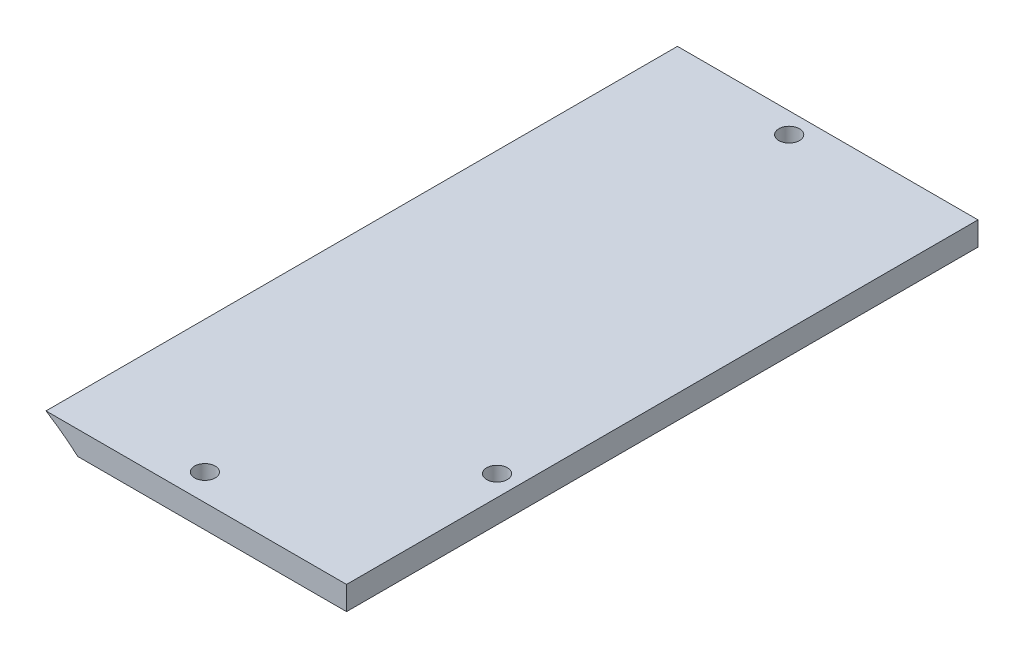
ISO-10303-21;
HEADER;
FILE_DESCRIPTION(('STEP AP214'),'2;1');
FILE_NAME('part.step','',(''),(''),'','','');
FILE_SCHEMA(('AUTOMOTIVE_DESIGN { 1 0 10303 214 1 1 1 1 }'));
ENDSEC;
DATA;
#1=APPLICATION_CONTEXT('core data for automotive mechanical design processes');
#2=APPLICATION_PROTOCOL_DEFINITION('international standard','automotive_design',2000,#1);
#3=PRODUCT_CONTEXT('',#1,'mechanical');
#4=PRODUCT('Part','Part','',(#3));
#5=PRODUCT_RELATED_PRODUCT_CATEGORY('part','',(#4));
#6=PRODUCT_DEFINITION_FORMATION('','',#4);
#7=PRODUCT_DEFINITION_CONTEXT('part definition',#1,'design');
#8=PRODUCT_DEFINITION('design','',#6,#7);
#9=PRODUCT_DEFINITION_SHAPE('','',#8);
#10=(LENGTH_UNIT() NAMED_UNIT(*) SI_UNIT(.MILLI.,.METRE.));
#11=(NAMED_UNIT(*) PLANE_ANGLE_UNIT() SI_UNIT($,.RADIAN.));
#12=(NAMED_UNIT(*) SI_UNIT($,.STERADIAN.) SOLID_ANGLE_UNIT());
#13=UNCERTAINTY_MEASURE_WITH_UNIT(LENGTH_MEASURE(1.E-05),#10,'distance_accuracy_value','');
#14=(GEOMETRIC_REPRESENTATION_CONTEXT(3) GLOBAL_UNCERTAINTY_ASSIGNED_CONTEXT((#13)) GLOBAL_UNIT_ASSIGNED_CONTEXT((#10,
#11,#12)) REPRESENTATION_CONTEXT('',''));
#15=CARTESIAN_POINT('',(0.,0.,0.));
#16=DIRECTION('',(0.,0.,1.));
#17=DIRECTION('',(1.,0.,0.));
#18=AXIS2_PLACEMENT_3D('',#15,#16,#17);
#19=CARTESIAN_POINT('',(72.,-34.,107.));
#20=DIRECTION('',(1.,0.,0.));
#21=DIRECTION('',(0.,0.,-1.));
#22=AXIS2_PLACEMENT_3D('',#19,#20,#21);
#23=PLANE('',#22);
#24=DIRECTION('',(0.,0.,-1.));
#25=VECTOR('',#24,1.);
#26=CARTESIAN_POINT('',(72.,34.,107.));
#27=LINE('',#26,#25);
#28=CARTESIAN_POINT('',(72.,34.,107.));
#29=VERTEX_POINT('',#28);
#30=CARTESIAN_POINT('',(72.,34.,0.));
#31=VERTEX_POINT('',#30);
#32=EDGE_CURVE('E103',#29,#31,#27,.T.);
#33=ORIENTED_EDGE('',*,*,#32,.F.);
#34=DIRECTION('',(0.,1.,0.));
#35=VECTOR('',#34,1.);
#36=CARTESIAN_POINT('',(72.,30.,107.));
#37=LINE('',#36,#35);
#38=CARTESIAN_POINT('',(72.,30.,107.));
#39=VERTEX_POINT('',#38);
#40=EDGE_CURVE('E89',#39,#29,#37,.T.);
#41=ORIENTED_EDGE('',*,*,#40,.F.);
#42=DIRECTION('',(0.,0.,-1.));
#43=VECTOR('',#42,1.);
#44=CARTESIAN_POINT('',(72.,30.,107.));
#45=LINE('',#44,#43);
#46=CARTESIAN_POINT('',(72.,30.,0.));
#47=VERTEX_POINT('',#46);
#48=EDGE_CURVE('E46',#39,#47,#45,.T.);
#49=ORIENTED_EDGE('',*,*,#48,.T.);
#50=DIRECTION('',(0.,-1.,0.));
#51=VECTOR('',#50,1.);
#52=CARTESIAN_POINT('',(72.,34.,0.));
#53=LINE('',#52,#51);
#54=EDGE_CURVE('E101',#31,#47,#53,.T.);
#55=ORIENTED_EDGE('',*,*,#54,.F.);
#56=EDGE_LOOP('',(#33,#41,#49,#55));
#57=FACE_BOUND('',#56,.T.);
#58=ADVANCED_FACE('F37',(#57),#23,.T.);
#59=CARTESIAN_POINT('',(72.,30.,107.));
#60=DIRECTION('',(0.,-1.,0.));
#61=DIRECTION('',(1.,0.,0.));
#62=AXIS2_PLACEMENT_3D('',#59,#60,#61);
#63=PLANE('',#62);
#64=CARTESIAN_POINT('',(68.5,30.,78.));
#65=DIRECTION('',(0.,-1.,0.));
#66=DIRECTION('',(1.,0.,0.));
#67=AXIS2_PLACEMENT_3D('',#64,#65,#66);
#68=CIRCLE('',#67,1.75000000000001);
#69=CARTESIAN_POINT('',(70.25,30.,78.));
#70=VERTEX_POINT('',#69);
#71=EDGE_CURVE('E124',#70,#70,#68,.T.);
#72=ORIENTED_EDGE('',*,*,#71,.F.);
#73=EDGE_LOOP('',(#72));
#74=FACE_BOUND('',#73,.T.);
#75=CARTESIAN_POINT('',(43.5,30.,3.50000000000001));
#76=DIRECTION('',(0.,-1.,0.));
#77=DIRECTION('',(1.,0.,0.));
#78=AXIS2_PLACEMENT_3D('',#75,#76,#77);
#79=CIRCLE('',#78,1.75);
#80=CARTESIAN_POINT('',(45.25,30.,3.50000000000001));
#81=VERTEX_POINT('',#80);
#82=EDGE_CURVE('E118',#81,#81,#79,.T.);
#83=ORIENTED_EDGE('',*,*,#82,.F.);
#84=EDGE_LOOP('',(#83));
#85=FACE_BOUND('',#84,.T.);
#86=CARTESIAN_POINT('',(43.5,30.,102.5));
#87=DIRECTION('',(0.,-1.,0.));
#88=DIRECTION('',(1.,0.,0.));
#89=AXIS2_PLACEMENT_3D('',#86,#87,#88);
#90=CIRCLE('',#89,1.75000000000001);
#91=CARTESIAN_POINT('',(45.25,30.,102.5));
#92=VERTEX_POINT('',#91);
#93=EDGE_CURVE('E111',#92,#92,#90,.T.);
#94=ORIENTED_EDGE('',*,*,#93,.F.);
#95=EDGE_LOOP('',(#94));
#96=FACE_BOUND('',#95,.T.);
#97=ORIENTED_EDGE('',*,*,#48,.F.);
#98=DIRECTION('',(1.,0.,0.));
#99=VECTOR('',#98,1.);
#100=CARTESIAN_POINT('',(26.4575131106459,30.,107.));
#101=LINE('',#100,#99);
#102=CARTESIAN_POINT('',(26.4575131106459,30.,107.));
#103=VERTEX_POINT('',#102);
#104=EDGE_CURVE('E80',#103,#39,#101,.T.);
#105=ORIENTED_EDGE('',*,*,#104,.F.);
#106=DIRECTION('',(0.,0.,-1.));
#107=VECTOR('',#106,1.);
#108=CARTESIAN_POINT('',(26.4575131106459,30.,107.));
#109=LINE('',#108,#107);
#110=CARTESIAN_POINT('',(26.4575131106459,30.,0.));
#111=VERTEX_POINT('',#110);
#112=EDGE_CURVE('E11',#103,#111,#109,.T.);
#113=ORIENTED_EDGE('',*,*,#112,.T.);
#114=DIRECTION('',(-1.,0.,0.));
#115=VECTOR('',#114,1.);
#116=CARTESIAN_POINT('',(72.,30.,0.));
#117=LINE('',#116,#115);
#118=EDGE_CURVE('E100',#47,#111,#117,.T.);
#119=ORIENTED_EDGE('',*,*,#118,.F.);
#120=EDGE_LOOP('',(#97,#105,#113,#119));
#121=FACE_BOUND('',#120,.T.);
#122=ADVANCED_FACE('F86',(#74,#85,#96,#121),#63,.T.);
#123=CARTESIAN_POINT('',(21.0713075057055,34.,107.));
#124=DIRECTION('',(0.,1.,0.));
#125=DIRECTION('',(-1.,0.,0.));
#126=AXIS2_PLACEMENT_3D('',#123,#124,#125);
#127=PLANE('',#126);
#128=CARTESIAN_POINT('',(68.5,34.,78.));
#129=DIRECTION('',(0.,1.,0.));
#130=DIRECTION('',(0.,0.,1.));
#131=AXIS2_PLACEMENT_3D('',#128,#129,#130);
#132=CIRCLE('',#131,1.75000000000001);
#133=CARTESIAN_POINT('',(68.5,34.,79.75));
#134=VERTEX_POINT('',#133);
#135=EDGE_CURVE('E98',#134,#134,#132,.T.);
#136=ORIENTED_EDGE('',*,*,#135,.F.);
#137=EDGE_LOOP('',(#136));
#138=FACE_BOUND('',#137,.T.);
#139=CARTESIAN_POINT('',(43.5,34.,3.50000000000001));
#140=DIRECTION('',(0.,1.,0.));
#141=DIRECTION('',(0.,0.,1.));
#142=AXIS2_PLACEMENT_3D('',#139,#140,#141);
#143=CIRCLE('',#142,1.75);
#144=CARTESIAN_POINT('',(43.5,34.,5.25000000000001));
#145=VERTEX_POINT('',#144);
#146=EDGE_CURVE('E121',#145,#145,#143,.T.);
#147=ORIENTED_EDGE('',*,*,#146,.F.);
#148=EDGE_LOOP('',(#147));
#149=FACE_BOUND('',#148,.T.);
#150=CARTESIAN_POINT('',(43.5,34.,102.5));
#151=DIRECTION('',(0.,1.,0.));
#152=DIRECTION('',(0.,0.,1.));
#153=AXIS2_PLACEMENT_3D('',#150,#151,#152);
#154=CIRCLE('',#153,1.75000000000001);
#155=CARTESIAN_POINT('',(43.5,34.,104.25));
#156=VERTEX_POINT('',#155);
#157=EDGE_CURVE('E113',#156,#156,#154,.T.);
#158=ORIENTED_EDGE('',*,*,#157,.F.);
#159=EDGE_LOOP('',(#158));
#160=FACE_BOUND('',#159,.T.);
#161=DIRECTION('',(0.,0.,-1.));
#162=VECTOR('',#161,1.);
#163=CARTESIAN_POINT('',(21.0713075057055,34.,107.));
#164=LINE('',#163,#162);
#165=CARTESIAN_POINT('',(21.0713075057055,34.,107.));
#166=VERTEX_POINT('',#165);
#167=CARTESIAN_POINT('',(21.0713075057055,34.,0.));
#168=VERTEX_POINT('',#167);
#169=EDGE_CURVE('E41',#166,#168,#164,.T.);
#170=ORIENTED_EDGE('',*,*,#169,.F.);
#171=DIRECTION('',(-1.,0.,0.));
#172=VECTOR('',#171,1.);
#173=CARTESIAN_POINT('',(72.,34.,107.));
#174=LINE('',#173,#172);
#175=EDGE_CURVE('E54',#29,#166,#174,.T.);
#176=ORIENTED_EDGE('',*,*,#175,.F.);
#177=ORIENTED_EDGE('',*,*,#32,.T.);
#178=DIRECTION('',(1.,0.,0.));
#179=VECTOR('',#178,1.);
#180=CARTESIAN_POINT('',(21.0713075057055,34.,0.));
#181=LINE('',#180,#179);
#182=EDGE_CURVE('E104',#168,#31,#181,.T.);
#183=ORIENTED_EDGE('',*,*,#182,.F.);
#184=EDGE_LOOP('',(#170,#176,#177,#183));
#185=FACE_BOUND('',#184,.T.);
#186=ADVANCED_FACE('F110',(#138,#149,#160,#185),#127,.T.);
#187=CARTESIAN_POINT('',(0.,0.,-2.));
#188=DIRECTION('',(0.,0.,1.));
#189=DIRECTION('',(1.,0.,0.));
#190=AXIS2_PLACEMENT_3D('',#187,#188,#189);
#191=CYLINDRICAL_SURFACE('',#190,40.);
#192=CARTESIAN_POINT('',(0.,0.,107.));
#193=DIRECTION('',(0.,0.,-1.));
#194=DIRECTION('',(1.,0.,0.));
#195=AXIS2_PLACEMENT_3D('',#192,#193,#194);
#196=CIRCLE('',#195,40.);
#197=EDGE_CURVE('E77',#166,#103,#196,.T.);
#198=ORIENTED_EDGE('',*,*,#197,.F.);
#199=ORIENTED_EDGE('',*,*,#169,.T.);
#200=CARTESIAN_POINT('',(0.,0.,0.));
#201=DIRECTION('',(0.,0.,1.));
#202=DIRECTION('',(1.,0.,0.));
#203=AXIS2_PLACEMENT_3D('',#200,#201,#202);
#204=CIRCLE('',#203,40.);
#205=EDGE_CURVE('E93',#111,#168,#204,.T.);
#206=ORIENTED_EDGE('',*,*,#205,.F.);
#207=ORIENTED_EDGE('',*,*,#112,.F.);
#208=EDGE_LOOP('',(#198,#199,#206,#207));
#209=FACE_BOUND('',#208,.T.);
#210=ADVANCED_FACE('F91',(#209),#191,.F.);
#211=CARTESIAN_POINT('',(0.,0.,0.));
#212=DIRECTION('',(0.,0.,1.));
#213=DIRECTION('',(1.,0.,0.));
#214=AXIS2_PLACEMENT_3D('',#211,#212,#213);
#215=PLANE('',#214);
#216=ORIENTED_EDGE('',*,*,#118,.T.);
#217=ORIENTED_EDGE('',*,*,#205,.T.);
#218=ORIENTED_EDGE('',*,*,#182,.T.);
#219=ORIENTED_EDGE('',*,*,#54,.T.);
#220=EDGE_LOOP('',(#216,#217,#218,#219));
#221=FACE_BOUND('',#220,.T.);
#222=ADVANCED_FACE('F39',(#221),#215,.F.);
#223=CARTESIAN_POINT('',(43.5,-40.,102.5));
#224=DIRECTION('',(0.,1.,0.));
#225=DIRECTION('',(0.,0.,1.));
#226=AXIS2_PLACEMENT_3D('',#223,#224,#225);
#227=CYLINDRICAL_SURFACE('',#226,1.75000000000001);
#228=ORIENTED_EDGE('',*,*,#93,.T.);
#229=EDGE_LOOP('',(#228));
#230=FACE_BOUND('',#229,.T.);
#231=ORIENTED_EDGE('',*,*,#157,.T.);
#232=EDGE_LOOP('',(#231));
#233=FACE_BOUND('',#232,.T.);
#234=ADVANCED_FACE('F141',(#230,#233),#227,.F.);
#235=CARTESIAN_POINT('',(43.5,-40.,3.50000000000001));
#236=DIRECTION('',(0.,1.,0.));
#237=DIRECTION('',(0.,0.,1.));
#238=AXIS2_PLACEMENT_3D('',#235,#236,#237);
#239=CYLINDRICAL_SURFACE('',#238,1.75);
#240=ORIENTED_EDGE('',*,*,#82,.T.);
#241=EDGE_LOOP('',(#240));
#242=FACE_BOUND('',#241,.T.);
#243=ORIENTED_EDGE('',*,*,#146,.T.);
#244=EDGE_LOOP('',(#243));
#245=FACE_BOUND('',#244,.T.);
#246=ADVANCED_FACE('F143',(#242,#245),#239,.F.);
#247=CARTESIAN_POINT('',(68.5,-40.,78.));
#248=DIRECTION('',(0.,1.,0.));
#249=DIRECTION('',(0.,0.,1.));
#250=AXIS2_PLACEMENT_3D('',#247,#248,#249);
#251=CYLINDRICAL_SURFACE('',#250,1.75000000000001);
#252=ORIENTED_EDGE('',*,*,#71,.T.);
#253=EDGE_LOOP('',(#252));
#254=FACE_BOUND('',#253,.T.);
#255=ORIENTED_EDGE('',*,*,#135,.T.);
#256=EDGE_LOOP('',(#255));
#257=FACE_BOUND('',#256,.T.);
#258=ADVANCED_FACE('F132',(#254,#257),#251,.F.);
#259=CARTESIAN_POINT('',(0.,0.,107.));
#260=DIRECTION('',(0.,0.,1.));
#261=DIRECTION('',(1.,0.,0.));
#262=AXIS2_PLACEMENT_3D('',#259,#260,#261);
#263=PLANE('',#262);
#264=ORIENTED_EDGE('',*,*,#197,.T.);
#265=ORIENTED_EDGE('',*,*,#104,.T.);
#266=ORIENTED_EDGE('',*,*,#40,.T.);
#267=ORIENTED_EDGE('',*,*,#175,.T.);
#268=EDGE_LOOP('',(#264,#265,#266,#267));
#269=FACE_BOUND('',#268,.T.);
#270=ADVANCED_FACE('F79',(#269),#263,.T.);
#271=CLOSED_SHELL('',(#58,#122,#186,#210,#222,#234,#246,#258,#270));
#272=MANIFOLD_SOLID_BREP('B2',#271);
#273=ADVANCED_BREP_SHAPE_REPRESENTATION('',(#18,#272),#14);
#274=SHAPE_DEFINITION_REPRESENTATION(#9,#273);
ENDSEC;
END-ISO-10303-21;
